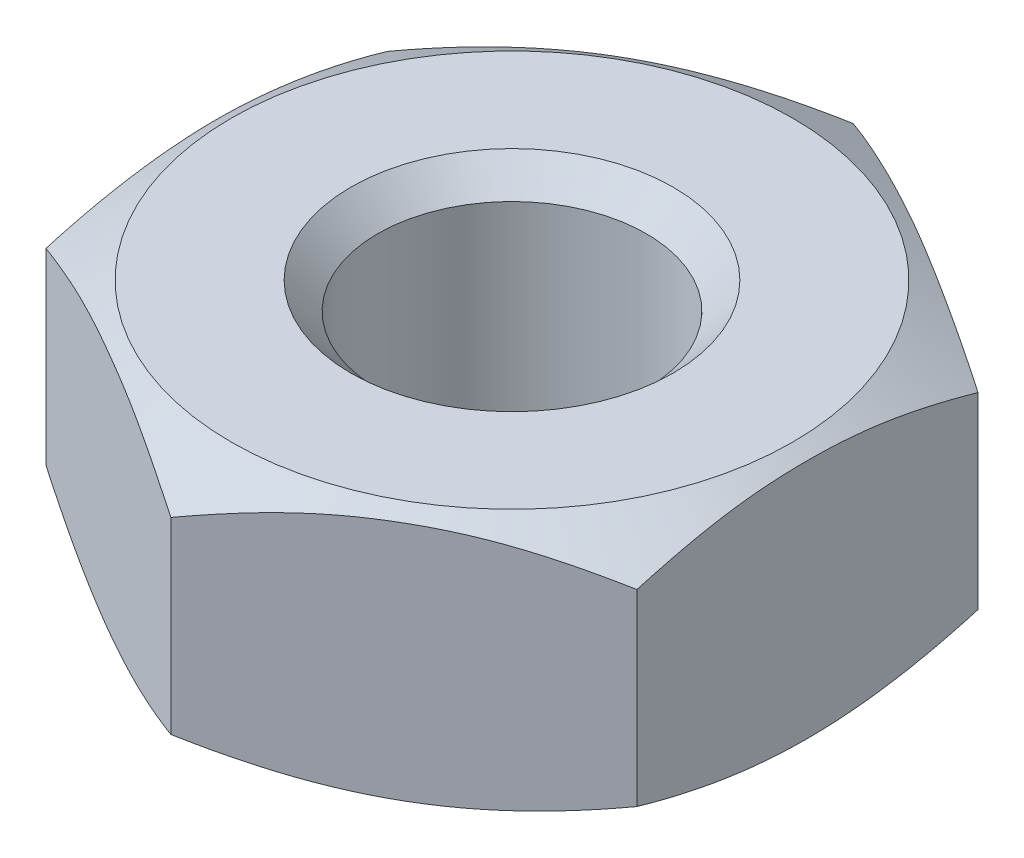
ISO-10303-21;
HEADER;
FILE_DESCRIPTION(('STEP AP214'),'2;1');
FILE_NAME('part.step','',(''),(''),'','','');
FILE_SCHEMA(('AUTOMOTIVE_DESIGN { 1 0 10303 214 1 1 1 1 }'));
ENDSEC;
DATA;
#1=APPLICATION_CONTEXT('core data for automotive mechanical design processes');
#2=APPLICATION_PROTOCOL_DEFINITION('international standard','automotive_design',2000,#1);
#3=PRODUCT_CONTEXT('',#1,'mechanical');
#4=PRODUCT('Part','Part','',(#3));
#5=PRODUCT_RELATED_PRODUCT_CATEGORY('part','',(#4));
#6=PRODUCT_DEFINITION_FORMATION('','',#4);
#7=PRODUCT_DEFINITION_CONTEXT('part definition',#1,'design');
#8=PRODUCT_DEFINITION('design','',#6,#7);
#9=PRODUCT_DEFINITION_SHAPE('','',#8);
#10=(LENGTH_UNIT() NAMED_UNIT(*) SI_UNIT(.MILLI.,.METRE.));
#11=(NAMED_UNIT(*) PLANE_ANGLE_UNIT() SI_UNIT($,.RADIAN.));
#12=(NAMED_UNIT(*) SI_UNIT($,.STERADIAN.) SOLID_ANGLE_UNIT());
#13=UNCERTAINTY_MEASURE_WITH_UNIT(LENGTH_MEASURE(1.E-05),#10,'distance_accuracy_value','');
#14=(GEOMETRIC_REPRESENTATION_CONTEXT(3) GLOBAL_UNCERTAINTY_ASSIGNED_CONTEXT((#13)) GLOBAL_UNIT_ASSIGNED_CONTEXT((#10,
#11,#12)) REPRESENTATION_CONTEXT('',''));
#15=CARTESIAN_POINT('',(0.,0.,0.));
#16=DIRECTION('',(0.,0.,1.));
#17=DIRECTION('',(1.,0.,0.));
#18=AXIS2_PLACEMENT_3D('',#15,#16,#17);
#19=CARTESIAN_POINT('',(-2.75,0.,-1.587713240271));
#20=DIRECTION('',(-1.,0.,0.));
#21=DIRECTION('',(0.,0.,1.));
#22=AXIS2_PLACEMENT_3D('',#19,#20,#21);
#23=PLANE('',#22);
#24=DIRECTION('',(0.,1.,0.));
#25=VECTOR('',#24,1.);
#26=CARTESIAN_POINT('',(-2.75000000001,0.3250057550854,-1.587713240281));
#27=LINE('',#26,#25);
#28=CARTESIAN_POINT('',(-2.75,0.3250057550754,-1.587713240271));
#29=VERTEX_POINT('',#28);
#30=CARTESIAN_POINT('',(-2.75,2.074994244925,-1.587713240271));
#31=VERTEX_POINT('',#30);
#32=EDGE_CURVE('E282',#29,#31,#27,.T.);
#33=ORIENTED_EDGE('',*,*,#32,.F.);
#34=CARTESIAN_POINT('',(-2.75,0.3250057550854,-1.587713240281));
#35=CARTESIAN_POINT('',(-2.75,0.201279179498766,-1.1591118099588));
#36=CARTESIAN_POINT('',(-2.75,0.1410366418846,-0.773480202368952));
#37=CARTESIAN_POINT('',(-2.75,0.079680933387279,-0.380722834573868));
#38=CARTESIAN_POINT('',(-2.75,0.079567033967487,-0.00101546801927507));
#39=CARTESIAN_POINT('',(-2.75,0.0794533710850477,0.377903352154305));
#40=CARTESIAN_POINT('',(-2.75,0.14081678660933,0.77195700034004));
#41=CARTESIAN_POINT('',(-2.75,0.200902921329479,1.15780841342647));
#42=CARTESIAN_POINT('',(-2.75,0.3250057550854,1.587713240281));
#43=B_SPLINE_CURVE_WITH_KNOTS('',2,(#34,#35,#36,#37,#38,#39,#40,#41,#42),.UNSPECIFIED.,.F.,.F.,
(3,2,2,2,3),(0.,0.25,0.5,0.75,1.),.UNSPECIFIED.);
#44=CARTESIAN_POINT('',(-2.75,0.3250057550754,1.587713240271));
#45=VERTEX_POINT('',#44);
#46=EDGE_CURVE('E329',#29,#45,#43,.T.);
#47=ORIENTED_EDGE('',*,*,#46,.T.);
#48=DIRECTION('',(0.,1.,0.));
#49=VECTOR('',#48,1.);
#50=CARTESIAN_POINT('',(-2.75000000001,0.3250057550854,1.587713240281));
#51=LINE('',#50,#49);
#52=CARTESIAN_POINT('',(-2.75,2.074994244925,1.587713240271));
#53=VERTEX_POINT('',#52);
#54=EDGE_CURVE('E30',#45,#53,#51,.T.);
#55=ORIENTED_EDGE('',*,*,#54,.T.);
#56=CARTESIAN_POINT('',(-2.74999999128356,2.07499422748575,-1.58771323523912));
#57=CARTESIAN_POINT('',(-2.75028148832825,2.09507326711435,-1.51765403939934));
#58=CARTESIAN_POINT('',(-2.75033237406656,2.11433844946116,-1.44735143186052));
#59=CARTESIAN_POINT('',(-2.75016787811501,2.15022786533262,-1.30882451519463));
#60=CARTESIAN_POINT('',(-2.74996219023658,2.16692302840137,-1.2406185090237));
#61=CARTESIAN_POINT('',(-2.7494801885173,2.19768112369123,-1.10589064822893));
#62=CARTESIAN_POINT('',(-2.74920632704011,2.21181084910529,-1.03938416137114));
#63=CARTESIAN_POINT('',(-2.74873977495083,2.23744125874207,-0.907613566677989));
#64=CARTESIAN_POINT('',(-2.74854520150109,2.24899954164689,-0.842360739382574));
#65=CARTESIAN_POINT('',(-2.74832627944972,2.26949868290227,-0.712606042844197));
#66=CARTESIAN_POINT('',(-2.74829902726868,2.27848159286191,-0.648110868234766));
#67=CARTESIAN_POINT('',(-2.74842907273076,2.29384752757066,-0.519336710230518));
#68=CARTESIAN_POINT('',(-2.74858488649798,2.3002508994918,-0.455060166015661));
#69=CARTESIAN_POINT('',(-2.74900813851976,2.31048153940453,-0.32615137386641));
#70=CARTESIAN_POINT('',(-2.74927583637636,2.31430276178358,-0.261518645910155));
#71=CARTESIAN_POINT('',(-2.749752682052,2.31939673345075,-0.131298643302522));
#72=CARTESIAN_POINT('',(-2.74996100955504,2.32063514430747,-0.0657100395514744));
#73=CARTESIAN_POINT('',(-2.75004026691913,2.32059274291269,0.0653820333948254));
#74=CARTESIAN_POINT('',(-2.74991163088768,2.31931517250674,0.130885503464186));
#75=CARTESIAN_POINT('',(-2.74958212628148,2.31415590081957,0.260970236794915));
#76=CARTESIAN_POINT('',(-2.74938218135719,2.31030697330503,0.325552786610539));
#77=CARTESIAN_POINT('',(-2.74907704428043,2.30003313195386,0.454392009355239));
#78=CARTESIAN_POINT('',(-2.74897167733799,2.29361300186953,0.51864906429048));
#79=CARTESIAN_POINT('',(-2.74891951786174,2.27822554808511,0.647411067741633));
#80=CARTESIAN_POINT('',(-2.74897408358454,2.26923699511454,0.711913466220587));
#81=CARTESIAN_POINT('',(-2.74921998209748,2.24873810873565,0.841705746512937));
#82=CARTESIAN_POINT('',(-2.7494137631477,2.23718522819615,0.906988857147244));
#83=CARTESIAN_POINT('',(-2.74984667367675,2.21157678267714,1.03883976727238));
#84=CARTESIAN_POINT('',(-2.75008686053937,2.19746345513721,1.10539627432707));
#85=CARTESIAN_POINT('',(-2.75046504105804,2.16674900917802,1.24024089860567));
#86=CARTESIAN_POINT('',(-2.75059940193158,2.15008117832634,1.30851370500105));
#87=CARTESIAN_POINT('',(-2.7505803113879,2.11425703758917,1.44718805778875));
#88=CARTESIAN_POINT('',(-2.75041567956702,2.09503003132231,1.51757140007469));
#89=CARTESIAN_POINT('',(-2.74999999128214,2.07499422748516,1.58771323524364));
#90=B_SPLINE_CURVE_WITH_KNOTS('',3,(#56,#57,#58,#59,#60,#61,#62,#63,#64,#65,#66,#67,#68,#69,#70,
#71,#72,#73,#74,#75,#76,#77,#78,#79,#80,#81,#82,#83,#84,#85,#86,#87,#88,#89),.UNSPECIFIED.,.F.,
.F.,(4,2,2,2,2,2,2,2,2,2,2,2,2,2,2,2,4),(0.,0.218648760864297,0.429281162177002,
0.633219332777679,0.831984197815678,1.02728985363373,1.22102328213142,1.41520874344338,
1.61195985519173,1.80845761870852,2.00249748222137,2.19617799707696,2.39150813131311,
2.59036019557369,2.79443503701656,3.00524234833371,3.22409536251514),.UNSPECIFIED.);
#91=EDGE_CURVE('E204',#31,#53,#90,.T.);
#92=ORIENTED_EDGE('',*,*,#91,.F.);
#93=EDGE_LOOP('',(#33,#47,#55,#92));
#94=FACE_BOUND('',#93,.T.);
#95=ADVANCED_FACE('F17',(#94),#23,.T.);
#96=CARTESIAN_POINT('',(2.75,0.,-1.587713240271));
#97=DIRECTION('',(0.500000000000017,0.,-0.866025403784429));
#98=DIRECTION('',(0.,-1.,0.));
#99=AXIS2_PLACEMENT_3D('',#96,#97,#98);
#100=PLANE('',#99);
#101=DIRECTION('',(0.,1.,0.));
#102=VECTOR('',#101,1.);
#103=CARTESIAN_POINT('',(2.75000000001,0.3250057550854,-1.587713240281));
#104=LINE('',#103,#102);
#105=CARTESIAN_POINT('',(2.75,0.3250057550754,-1.587713240271));
#106=VERTEX_POINT('',#105);
#107=CARTESIAN_POINT('',(2.75,2.074994244925,-1.587713240271));
#108=VERTEX_POINT('',#107);
#109=EDGE_CURVE('E143',#106,#108,#104,.T.);
#110=ORIENTED_EDGE('',*,*,#109,.F.);
#111=CARTESIAN_POINT('',(2.75000000000317,0.3250057550854,-1.58771324026917));
#112=CARTESIAN_POINT('',(2.37882029603068,0.201279187094432,-1.80201394227542));
#113=CARTESIAN_POINT('',(2.04485346758023,0.141036654216811,-1.9948297805817));
#114=CARTESIAN_POINT('',(1.70471559073008,0.0796809581312348,-2.19120847534273));
#115=CARTESIAN_POINT('',(1.37587932246273,0.0795670668543331,-2.38106218334621));
#116=CARTESIAN_POINT('',(1.0477259793583,0.0794534121061428,-2.57052160432304));
#117=CARTESIAN_POINT('',(0.706465516113512,0.140816823607388,-2.7675484246412));
#118=CARTESIAN_POINT('',(0.372308408456231,0.200902952273666,-2.96047412069877));
#119=CARTESIAN_POINT('',(-4.53196508098941E-12,0.3250057550854,-3.17542648054516));
#120=B_SPLINE_CURVE_WITH_KNOTS('',2,(#111,#112,#113,#114,#115,#116,#117,#118,#119),
.UNSPECIFIED.,.F.,.F.,(3,2,2,2,3),(0.,0.25,0.5,0.75,1.),.UNSPECIFIED.);
#121=CARTESIAN_POINT('',(0.,0.3250057550754,-3.175426480543));
#122=VERTEX_POINT('',#121);
#123=EDGE_CURVE('E128',#106,#122,#120,.T.);
#124=ORIENTED_EDGE('',*,*,#123,.T.);
#125=DIRECTION('',(0.,1.,0.));
#126=VECTOR('',#125,1.);
#127=CARTESIAN_POINT('',(0.,0.3250057550854,-3.175426480553));
#128=LINE('',#127,#126);
#129=CARTESIAN_POINT('',(0.,2.074994244925,-3.175426480543));
#130=VERTEX_POINT('',#129);
#131=EDGE_CURVE('E278',#122,#130,#128,.T.);
#132=ORIENTED_EDGE('',*,*,#131,.T.);
#133=CARTESIAN_POINT('',(2.74999999128246,2.07499422748652,-1.58771323523834));
#134=CARTESIAN_POINT('',(2.68946507508229,2.09507413711056,-1.62298814266291));
#135=CARTESIAN_POINT('',(2.628604042085,2.11434009659803,-1.65818507938357));
#136=CARTESIAN_POINT('',(2.50854872233432,2.15023083966827,-1.72730925016274));
#137=CARTESIAN_POINT('',(2.44937513360386,2.16692655898418,-1.76123572539283));
#138=CARTESIAN_POINT('',(2.33245112868928,2.19768554062108,-1.82818549374969));
#139=CARTESIAN_POINT('',(2.2747152475352,2.21181560027566,-1.86120322533643));
#140=CARTESIAN_POINT('',(2.16035990506031,2.23744645502464,-1.92668786362478));
#141=CARTESIAN_POINT('',(2.1037492712936,2.24900484957543,-1.95914749941278));
#142=CARTESIAN_POINT('',(1.99126329084751,2.26950399344229,-2.02383878722816));
#143=CARTESIAN_POINT('',(1.93539228971531,2.27848679055797,-2.05606457861549));
#144=CARTESIAN_POINT('',(1.82392952075254,2.29385228784722,-2.1205679570167));
#145=CARTESIAN_POINT('',(1.76833912295323,2.30025532591689,-2.15284304126767));
#146=CARTESIAN_POINT('',(1.65690573063352,2.3104850774732,-2.21766780195512));
#147=CARTESIAN_POINT('',(1.60106244941793,2.31430573065541,-2.25021794405274));
#148=CARTESIAN_POINT('',(1.48851942609571,2.31939840295763,-2.31574474984088));
#149=CARTESIAN_POINT('',(1.4318181203404,2.32063606515242,-2.34872136402434));
#150=CARTESIAN_POINT('',(1.31832826433659,2.32059182837136,-2.41433531138168));
#151=CARTESIAN_POINT('',(1.26153995316628,2.31931351336994,-2.44697306068883));
#152=CARTESIAN_POINT('',(1.14872565201552,2.31415294918607,-2.51172538544415));
#153=CARTESIAN_POINT('',(1.09269900780987,2.31030345539606,-2.54384140019746));
#154=CARTESIAN_POINT('',(0.98097507072716,2.30002873020264,-2.60799282796062));
#155=CARTESIAN_POINT('',(0.925277360730478,2.29360826799681,-2.64002828030042));
#156=CARTESIAN_POINT('',(0.813746350786424,2.27822037895175,-2.70436066117416));
#157=CARTESIAN_POINT('',(0.757915940192916,2.26923171366002,-2.73665749150808));
#158=CARTESIAN_POINT('',(0.645641366380799,2.24873282968953,-2.80176345170299));
#159=CARTESIAN_POINT('',(0.58920429254756,2.23718006011364,-2.83457131647058));
#160=CARTESIAN_POINT('',(0.475240137136877,2.21157205714959,-2.90086871616841));
#161=CARTESIAN_POINT('',(0.417723363848265,2.19745906196917,-2.93435352031078));
#162=CARTESIAN_POINT('',(0.301139037682912,2.1667454974526,-3.00210043505811));
#163=CARTESIAN_POINT('',(0.242082926724602,2.15007821978347,-3.03635174338758));
#164=CARTESIAN_POINT('',(0.121983233745394,2.11425539899494,-3.10566944326282));
#165=CARTESIAN_POINT('',(0.0609498245001459,2.09502916562337,-3.14071704926184));
#166=CARTESIAN_POINT('',(-1.35975896060945E-12,2.07499422748653,-3.17542647047675));
#167=B_SPLINE_CURVE_WITH_KNOTS('',3,(#133,#134,#135,#136,#137,#138,#139,#140,#141,#142,#143,
#144,#145,#146,#147,#148,#149,#150,#151,#152,#153,#154,#155,#156,#157,#158,#159,#160,#161,#162,
#163,#164,#165,#166),.UNSPECIFIED.,.F.,.F.,(4,2,2,2,2,2,2,2,2,2,2,2,2,2,2,2,4),(0.,
0.218658229031319,0.429299945728665,0.633247468775946,0.83202194777125,1.02733773360048,
1.22108208454189,1.41527954781984,1.61204402697204,1.8085284207218,2.00255627663355,
2.19622586213315,2.39154586032507,2.59038830766808,2.79445379885586,3.00525180396911,
3.22409536767955),.UNSPECIFIED.);
#168=EDGE_CURVE('E255',#108,#130,#167,.T.);
#169=ORIENTED_EDGE('',*,*,#168,.F.);
#170=EDGE_LOOP('',(#110,#124,#132,#169));
#171=FACE_BOUND('',#170,.T.);
#172=ADVANCED_FACE('F19',(#171),#100,.T.);
#173=CARTESIAN_POINT('',(0.,0.,3.175426480543));
#174=DIRECTION('',(0.500000000000017,0.,0.866025403784429));
#175=DIRECTION('',(0.,-1.,0.));
#176=AXIS2_PLACEMENT_3D('',#173,#174,#175);
#177=PLANE('',#176);
#178=DIRECTION('',(0.,1.,0.));
#179=VECTOR('',#178,1.);
#180=CARTESIAN_POINT('',(0.,0.3250057550854,3.175426480553));
#181=LINE('',#180,#179);
#182=CARTESIAN_POINT('',(0.,0.3250057550754,3.175426480543));
#183=VERTEX_POINT('',#182);
#184=CARTESIAN_POINT('',(0.,2.074994244925,3.175426480543));
#185=VERTEX_POINT('',#184);
#186=EDGE_CURVE('E11',#183,#185,#181,.T.);
#187=ORIENTED_EDGE('',*,*,#186,.F.);
#188=CARTESIAN_POINT('',(-4.33015720195764E-12,0.3250057550854,3.1754264805455));
#189=CARTESIAN_POINT('',(0.371179704012347,0.201279187088551,2.96112577851374));
#190=CARTESIAN_POINT('',(0.705146532490621,0.14103665421062,2.76830994019139));
#191=CARTESIAN_POINT('',(1.0452844093586,0.0796809581266252,2.57193124542007));
#192=CARTESIAN_POINT('',(1.37412067762929,0.079567066853248,2.38207753741466));
#193=CARTESIAN_POINT('',(1.70227402072653,0.0794534121085786,2.19261811644198));
#194=CARTESIAN_POINT('',(2.04353448395308,0.140816823611951,1.99559129613435));
#195=CARTESIAN_POINT('',(2.37769159157981,0.200902952278033,1.80266560009442));
#196=CARTESIAN_POINT('',(2.75000000000337,0.3250057550854,1.58771324026951));
#197=B_SPLINE_CURVE_WITH_KNOTS('',2,(#188,#189,#190,#191,#192,#193,#194,#195,#196),
.UNSPECIFIED.,.F.,.F.,(3,2,2,2,3),(0.,0.25,0.5,0.75,1.),.UNSPECIFIED.);
#198=CARTESIAN_POINT('',(2.75,0.3250057550754,1.587713240271));
#199=VERTEX_POINT('',#198);
#200=EDGE_CURVE('E115',#183,#199,#197,.T.);
#201=ORIENTED_EDGE('',*,*,#200,.T.);
#202=DIRECTION('',(0.,1.,0.));
#203=VECTOR('',#202,1.);
#204=CARTESIAN_POINT('',(2.75000000001,0.3250057550854,1.587713240281));
#205=LINE('',#204,#203);
#206=CARTESIAN_POINT('',(2.75,2.074994244925,1.587713240271));
#207=VERTEX_POINT('',#206);
#208=EDGE_CURVE('E121',#199,#207,#205,.T.);
#209=ORIENTED_EDGE('',*,*,#208,.T.);
#210=CARTESIAN_POINT('',(-1.15211104051648E-12,2.07499422748638,3.17542647047701));
#211=CARTESIAN_POINT('',(0.0608164240454571,2.0950741371104,3.14063914894404));
#212=CARTESIAN_POINT('',(0.12172838188024,2.11434009659787,3.10553041662813));
#213=CARTESIAN_POINT('',(0.241619329666963,2.15023083966811,3.03612154525407));
#214=CARTESIAN_POINT('',(0.300587313442756,2.16692655898401,3.00183895179538));
#215=CARTESIAN_POINT('',(0.417029516075231,2.19768554062092,2.9340546774054));
#216=CARTESIAN_POINT('',(0.474491650981954,2.2118156002755,2.90056280340936));
#217=CARTESIAN_POINT('',(0.588380682535034,2.23744645502448,2.83427049091164));
#218=CARTESIAN_POINT('',(0.64479686860844,2.24900484957526,2.80147406183925));
#219=CARTESIAN_POINT('',(0.757064157483081,2.26950399344212,2.7364039891109));
#220=CARTESIAN_POINT('',(0.812908012047544,2.2784867905578,2.70413117848918));
#221=CARTESIAN_POINT('',(0.924500960853926,2.29385228784706,2.63985327819186));
#222=CARTESIAN_POINT('',(0.980247202623946,2.30025532591673,2.60784812361669));
#223=CARTESIAN_POINT('',(1.09210378833273,2.31048507747304,2.54375635538182));
#224=CARTESIAN_POINT('',(1.14821467889347,2.31430573065526,2.51166972626739));
#225=CARTESIAN_POINT('',(1.26123406899506,2.31939840295747,2.44696801194611));
#226=CARTESIAN_POINT('',(1.3181433074859,2.32063606515226,2.41435154782628));
#227=CARTESIAN_POINT('',(1.43171158074173,2.32059182837122,2.34887342313388));
#228=CARTESIAN_POINT('',(1.4883708563496,2.31931351336979,2.31601217767573));
#229=CARTESIAN_POINT('',(1.60085516511782,2.31415294918591,2.25068828934621));
#230=CARTESIAN_POINT('',(1.65668177186557,2.31030345539591,2.21822579955178));
#231=CARTESIAN_POINT('',(1.76810050653922,2.30002873020249,2.15354574570855));
#232=CARTESIAN_POINT('',(1.82369287708568,2.29360826799666,2.12132784008855));
#233=CARTESIAN_POINT('',(1.93517185818045,2.2782203789516,2.0569053426039));
#234=CARTESIAN_POINT('',(1.99105693900811,2.26923171365988,2.02470320389308));
#235=CARTESIAN_POINT('',(2.10357764138068,2.24873282968938,1.9600235508701));
#236=CARTESIAN_POINT('',(2.16020862262988,2.23718006011349,1.92755154359907));
#237=CARTESIAN_POINT('',(2.27460593267817,2.21157205714945,1.86200438974164));
#238=CARTESIAN_POINT('',(2.33236301035036,2.19745906196902,1.82893580500132));
#239=CARTESIAN_POINT('',(2.44932572263187,2.16674549745246,1.76184427423311));
#240=CARTESIAN_POINT('',(2.50851628123698,2.15007821978333,1.72782583605952));
#241=CARTESIAN_POINT('',(2.62859701674996,2.1142553989948,1.65847530089116));
#242=CARTESIAN_POINT('',(2.6894658385093,2.09502916562323,1.62314262100517));
#243=CARTESIAN_POINT('',(2.74999999128258,2.07499422748638,1.58771323523864));
#244=B_SPLINE_CURVE_WITH_KNOTS('',3,(#210,#211,#212,#213,#214,#215,#216,#217,#218,#219,#220,
#221,#222,#223,#224,#225,#226,#227,#228,#229,#230,#231,#232,#233,#234,#235,#236,#237,#238,#239,
#240,#241,#242,#243),.UNSPECIFIED.,.F.,.F.,(4,2,2,2,2,2,2,2,2,2,2,2,2,2,2,2,4),(0.,
0.218658229032988,0.429299945731537,0.633247468779547,0.832021947775108,1.02733773360411,
1.2210820845448,1.41527954782154,1.61204402697203,1.80852842072312,2.00255627663581,
2.19622586213596,2.39154586032805,2.59038830767085,2.79445379885804,3.00525180397033,
3.22409536767943),.UNSPECIFIED.);
#245=EDGE_CURVE('E253',#185,#207,#244,.T.);
#246=ORIENTED_EDGE('',*,*,#245,.F.);
#247=EDGE_LOOP('',(#187,#201,#209,#246));
#248=FACE_BOUND('',#247,.T.);
#249=ADVANCED_FACE('F118',(#248),#177,.T.);
#250=CARTESIAN_POINT('',(-2.75,0.,1.587713240271));
#251=DIRECTION('',(-0.500000000000017,0.,0.866025403784429));
#252=DIRECTION('',(0.,1.,0.));
#253=AXIS2_PLACEMENT_3D('',#250,#251,#252);
#254=PLANE('',#253);
#255=ORIENTED_EDGE('',*,*,#54,.F.);
#256=CARTESIAN_POINT('',(-2.75000000000317,0.3250057550854,1.58771324026917));
#257=CARTESIAN_POINT('',(-2.37882029603068,0.201279187094432,1.80201394227542));
#258=CARTESIAN_POINT('',(-2.04485346758023,0.141036654216811,1.9948297805817));
#259=CARTESIAN_POINT('',(-1.70471559073008,0.0796809581312348,2.19120847534273));
#260=CARTESIAN_POINT('',(-1.37587932246273,0.0795670668543331,2.38106218334621));
#261=CARTESIAN_POINT('',(-1.0477259793583,0.0794534121061428,2.57052160432304));
#262=CARTESIAN_POINT('',(-0.706465516113512,0.140816823607388,2.7675484246412));
#263=CARTESIAN_POINT('',(-0.372308408456231,0.200902952273666,2.96047412069877));
#264=CARTESIAN_POINT('',(4.53196508098941E-12,0.3250057550854,3.17542648054516));
#265=B_SPLINE_CURVE_WITH_KNOTS('',2,(#256,#257,#258,#259,#260,#261,#262,#263,#264),
.UNSPECIFIED.,.F.,.F.,(3,2,2,2,3),(0.,0.25,0.5,0.75,1.),.UNSPECIFIED.);
#266=EDGE_CURVE('E127',#45,#183,#265,.T.);
#267=ORIENTED_EDGE('',*,*,#266,.T.);
#268=ORIENTED_EDGE('',*,*,#186,.T.);
#269=CARTESIAN_POINT('',(-2.74999999128247,2.07499422748652,1.58771323523833));
#270=CARTESIAN_POINT('',(-2.6894650750823,2.09507413711056,1.62298814266289));
#271=CARTESIAN_POINT('',(-2.62860404208501,2.11434009659803,1.65818507938355));
#272=CARTESIAN_POINT('',(-2.50854872233433,2.15023083966827,1.72730925016272));
#273=CARTESIAN_POINT('',(-2.44937513360387,2.16692655898418,1.76123572539282));
#274=CARTESIAN_POINT('',(-2.3324511286893,2.19768554062108,1.82818549374967));
#275=CARTESIAN_POINT('',(-2.27471524753521,2.21181560027566,1.86120322533641));
#276=CARTESIAN_POINT('',(-2.16035990506032,2.23744645502464,1.92668786362476));
#277=CARTESIAN_POINT('',(-2.10374927129362,2.24900484957543,1.95914749941276));
#278=CARTESIAN_POINT('',(-1.99126329084752,2.26950399344229,2.02383878722815));
#279=CARTESIAN_POINT('',(-1.93539228971533,2.27848679055797,2.05606457861547));
#280=CARTESIAN_POINT('',(-1.82392952075255,2.29385228784722,2.12056795701669));
#281=CARTESIAN_POINT('',(-1.76833912295323,2.30025532591689,2.15284304126766));
#282=CARTESIAN_POINT('',(-1.65690573063352,2.3104850774732,2.21766780195511));
#283=CARTESIAN_POINT('',(-1.60106244941793,2.31430573065541,2.25021794405274));
#284=CARTESIAN_POINT('',(-1.4885194260957,2.31939840295763,2.31574474984088));
#285=CARTESIAN_POINT('',(-1.4318181203404,2.32063606515242,2.34872136402434));
#286=CARTESIAN_POINT('',(-1.31832826433658,2.32059182837136,2.4143353113817));
#287=CARTESIAN_POINT('',(-1.26153995316625,2.31931351336994,2.44697306068885));
#288=CARTESIAN_POINT('',(-1.14872565201546,2.31415294918607,2.51172538544417));
#289=CARTESIAN_POINT('',(-1.09269900780981,2.31030345539606,2.54384140019749));
#290=CARTESIAN_POINT('',(-0.98097507072708,2.30002873020264,2.60799282796065));
#291=CARTESIAN_POINT('',(-0.925277360730392,2.29360826799681,2.64002828030045));
#292=CARTESIAN_POINT('',(-0.813746350786328,2.27822037895175,2.70436066117419));
#293=CARTESIAN_POINT('',(-0.757915940192816,2.26923171366002,2.73665749150811));
#294=CARTESIAN_POINT('',(-0.645641366380697,2.24873282968953,2.80176345170302));
#295=CARTESIAN_POINT('',(-0.589204292547459,2.23718006011364,2.8345713164706));
#296=CARTESIAN_POINT('',(-0.475240137136781,2.21157205714959,2.90086871616842));
#297=CARTESIAN_POINT('',(-0.417723363848173,2.19745906196917,2.9343535203108));
#298=CARTESIAN_POINT('',(-0.301139037682834,2.1667454974526,3.00210043505812));
#299=CARTESIAN_POINT('',(-0.242082926724534,2.15007821978347,3.03635174338758));
#300=CARTESIAN_POINT('',(-0.121983233745351,2.11425539899494,3.10566944326282));
#301=CARTESIAN_POINT('',(-0.0609498245001176,2.09502916562337,3.14071704926184));
#302=CARTESIAN_POINT('',(1.3720979711413E-12,2.07499422748653,3.17542647047675));
#303=B_SPLINE_CURVE_WITH_KNOTS('',3,(#269,#270,#271,#272,#273,#274,#275,#276,#277,#278,#279,
#280,#281,#282,#283,#284,#285,#286,#287,#288,#289,#290,#291,#292,#293,#294,#295,#296,#297,#298,
#299,#300,#301,#302),.UNSPECIFIED.,.F.,.F.,(4,2,2,2,2,2,2,2,2,2,2,2,2,2,2,2,4),(0.,
0.218658229031318,0.429299945728663,0.633247468775944,0.832021947771249,1.02733773360049,
1.2210820845419,1.41527954781986,1.61204402697207,1.80852842072187,2.00255627663365,
2.19622586213327,2.39154586032519,2.5903883076682,2.79445379885596,3.00525180396919,
3.22409536767958),.UNSPECIFIED.);
#304=EDGE_CURVE('E275',#53,#185,#303,.T.);
#305=ORIENTED_EDGE('',*,*,#304,.F.);
#306=EDGE_LOOP('',(#255,#267,#268,#305));
#307=FACE_BOUND('',#306,.T.);
#308=ADVANCED_FACE('F168',(#307),#254,.T.);
#309=CARTESIAN_POINT('',(0.,2.275,0.));
#310=DIRECTION('',(0.,1.,0.));
#311=DIRECTION('',(1.,0.,0.));
#312=AXIS2_PLACEMENT_3D('',#309,#310,#311);
#313=CONICAL_SURFACE('',#312,1.375,0.7853981634);
#314=CARTESIAN_POINT('',(0.,2.15000000001,0.));
#315=DIRECTION('',(0.,1.,0.));
#316=DIRECTION('',(1.,0.,0.));
#317=AXIS2_PLACEMENT_3D('',#314,#315,#316);
#318=CIRCLE('',#317,1.25);
#319=CARTESIAN_POINT('',(1.25,2.15000000001,0.));
#320=VERTEX_POINT('',#319);
#321=EDGE_CURVE('E41',#320,#320,#318,.T.);
#322=ORIENTED_EDGE('',*,*,#321,.F.);
#323=EDGE_LOOP('',(#322));
#324=FACE_BOUND('',#323,.T.);
#325=CARTESIAN_POINT('',(0.,2.40000000001,0.));
#326=DIRECTION('',(0.,1.,0.));
#327=DIRECTION('',(-1.,0.,0.));
#328=AXIS2_PLACEMENT_3D('',#325,#326,#327);
#329=CIRCLE('',#328,1.5);
#330=CARTESIAN_POINT('',(-1.5,2.40000000001,0.));
#331=VERTEX_POINT('',#330);
#332=EDGE_CURVE('E274',#331,#331,#329,.T.);
#333=ORIENTED_EDGE('',*,*,#332,.T.);
#334=EDGE_LOOP('',(#333));
#335=FACE_BOUND('',#334,.T.);
#336=ADVANCED_FACE('F176',(#324,#335),#313,.F.);
#337=CARTESIAN_POINT('',(0.,2.4,0.));
#338=DIRECTION('',(0.,-1.,0.));
#339=DIRECTION('',(1.,0.,0.));
#340=AXIS2_PLACEMENT_3D('',#337,#338,#339);
#341=CYLINDRICAL_SURFACE('',#340,1.25);
#342=CARTESIAN_POINT('',(0.,0.25000000001,0.));
#343=DIRECTION('',(0.,1.,0.));
#344=DIRECTION('',(-1.,0.,0.));
#345=AXIS2_PLACEMENT_3D('',#342,#343,#344);
#346=CIRCLE('',#345,1.25);
#347=CARTESIAN_POINT('',(-1.25,0.25000000001,0.));
#348=VERTEX_POINT('',#347);
#349=EDGE_CURVE('E48',#348,#348,#346,.T.);
#350=ORIENTED_EDGE('',*,*,#349,.F.);
#351=EDGE_LOOP('',(#350));
#352=FACE_BOUND('',#351,.T.);
#353=ORIENTED_EDGE('',*,*,#321,.T.);
#354=EDGE_LOOP('',(#353));
#355=FACE_BOUND('',#354,.T.);
#356=ADVANCED_FACE('F356',(#352,#355),#341,.F.);
#357=CARTESIAN_POINT('',(0.,0.125,0.));
#358=DIRECTION('',(0.,-1.,0.));
#359=DIRECTION('',(-1.,0.,0.));
#360=AXIS2_PLACEMENT_3D('',#357,#358,#359);
#361=CONICAL_SURFACE('',#360,1.375,0.7853981634);
#362=ORIENTED_EDGE('',*,*,#349,.T.);
#363=EDGE_LOOP('',(#362));
#364=FACE_BOUND('',#363,.T.);
#365=CARTESIAN_POINT('',(0.,0.,0.));
#366=DIRECTION('',(0.,1.,0.));
#367=DIRECTION('',(-1.,0.,0.));
#368=AXIS2_PLACEMENT_3D('',#365,#366,#367);
#369=CIRCLE('',#368,1.5);
#370=CARTESIAN_POINT('',(-1.5,0.,0.));
#371=VERTEX_POINT('',#370);
#372=EDGE_CURVE('E279',#371,#371,#369,.T.);
#373=ORIENTED_EDGE('',*,*,#372,.F.);
#374=EDGE_LOOP('',(#373));
#375=FACE_BOUND('',#374,.T.);
#376=ADVANCED_FACE('F366',(#364,#375),#361,.F.);
#377=CARTESIAN_POINT('',(0.,0.,0.));
#378=DIRECTION('',(0.,1.,0.));
#379=DIRECTION('',(1.,0.,0.));
#380=AXIS2_PLACEMENT_3D('',#377,#378,#379);
#381=PLANE('',#380);
#382=ORIENTED_EDGE('',*,*,#372,.T.);
#383=EDGE_LOOP('',(#382));
#384=FACE_BOUND('',#383,.T.);
#385=CARTESIAN_POINT('',(0.,0.,0.));
#386=DIRECTION('',(0.,1.,0.));
#387=DIRECTION('',(-0.866025403783729,0.,-0.50000000000123));
#388=AXIS2_PLACEMENT_3D('',#385,#386,#387);
#389=CIRCLE('',#388,2.6125);
#390=CARTESIAN_POINT('',(-2.26249136738499,0.,-1.30625000000321));
#391=VERTEX_POINT('',#390);
#392=EDGE_CURVE('E256',#391,#391,#389,.T.);
#393=ORIENTED_EDGE('',*,*,#392,.F.);
#394=EDGE_LOOP('',(#393));
#395=FACE_BOUND('',#394,.T.);
#396=ADVANCED_FACE('F313',(#384,#395),#381,.F.);
#397=CARTESIAN_POINT('',(0.,0.,-3.175426480543));
#398=DIRECTION('',(-0.500000000000017,0.,-0.866025403784429));
#399=DIRECTION('',(-0.866025403784429,0.,0.500000000000017));
#400=AXIS2_PLACEMENT_3D('',#397,#398,#399);
#401=PLANE('',#400);
#402=ORIENTED_EDGE('',*,*,#131,.F.);
#403=CARTESIAN_POINT('',(4.33015720195764E-12,0.3250057550854,-3.1754264805455));
#404=CARTESIAN_POINT('',(-0.371179704012272,0.201279187088578,-2.96112577851378));
#405=CARTESIAN_POINT('',(-0.705146532490594,0.141036654210603,-2.76830994019141));
#406=CARTESIAN_POINT('',(-1.0452844093585,0.0796809581265867,-2.57193124542013));
#407=CARTESIAN_POINT('',(-1.37412067762919,0.0795670668532095,-2.38207753741472));
#408=CARTESIAN_POINT('',(-1.70227402072643,0.0794534121085402,-2.19261811644204));
#409=CARTESIAN_POINT('',(-2.04353448395296,0.140816823611911,-1.99559129613442));
#410=CARTESIAN_POINT('',(-2.37769159157967,0.200902952277988,-1.8026656000945));
#411=CARTESIAN_POINT('',(-2.75000000000337,0.3250057550854,-1.58771324026951));
#412=B_SPLINE_CURVE_WITH_KNOTS('',2,(#403,#404,#405,#406,#407,#408,#409,#410,#411),
.UNSPECIFIED.,.F.,.F.,(3,2,2,2,3),(0.,0.25,0.5,0.75,1.),.UNSPECIFIED.);
#413=EDGE_CURVE('E394',#122,#29,#412,.T.);
#414=ORIENTED_EDGE('',*,*,#413,.T.);
#415=ORIENTED_EDGE('',*,*,#32,.T.);
#416=CARTESIAN_POINT('',(1.16797548262885E-12,2.07499422748638,-3.17542647047702));
#417=CARTESIAN_POINT('',(-0.0608164240451862,2.09507413711031,-3.1406391489442));
#418=CARTESIAN_POINT('',(-0.12172838187973,2.11434009659769,-3.10553041662847));
#419=CARTESIAN_POINT('',(-0.241619329666093,2.15023083966776,-3.03612154525474));
#420=CARTESIAN_POINT('',(-0.300587313441763,2.1669265589836,-3.00183895179619));
#421=CARTESIAN_POINT('',(-0.417029516074095,2.1976855406204,-2.93405467740646));
#422=CARTESIAN_POINT('',(-0.474491650980798,2.21181560027494,-2.90056280341052));
#423=CARTESIAN_POINT('',(-0.588380682533917,2.23744645502387,-2.83427049091295));
#424=CARTESIAN_POINT('',(-0.644796868607383,2.24900484957464,-2.80147406184061));
#425=CARTESIAN_POINT('',(-0.75706415748221,2.2695039934415,-2.73640398911227));
#426=CARTESIAN_POINT('',(-0.8129080120468,2.27848679055719,-2.70413117849051));
#427=CARTESIAN_POINT('',(-0.924500960853483,2.2938522878465,-2.63985327819305));
#428=CARTESIAN_POINT('',(-0.980247202623678,2.30025532591621,-2.60784812361776));
#429=CARTESIAN_POINT('',(-1.09210378833284,2.31048507747262,-2.54375635538257));
#430=CARTESIAN_POINT('',(-1.14821467889379,2.3143057306549,-2.51166972626793));
#431=CARTESIAN_POINT('',(-1.2612340689958,2.31939840295728,-2.44696801194611));
#432=CARTESIAN_POINT('',(-1.31814330748684,2.32063606515217,-2.41435154782594));
#433=CARTESIAN_POINT('',(-1.43171158074243,2.32059182837131,-2.34887342313326));
#434=CARTESIAN_POINT('',(-1.48837085634986,2.31931351336998,-2.31601217767516));
#435=CARTESIAN_POINT('',(-1.60085516511732,2.31415294918625,-2.25068828934582));
#436=CARTESIAN_POINT('',(-1.65668177186477,2.3103034553963,-2.21822579955151));
#437=CARTESIAN_POINT('',(-1.76810050653793,2.30002873020296,-2.15354574570854));
#438=CARTESIAN_POINT('',(-1.82369287708421,2.29360826799715,-2.12132784008868));
#439=CARTESIAN_POINT('',(-1.93517185817873,2.27822037895212,-2.0569053426043));
#440=CARTESIAN_POINT('',(-1.99105693900633,2.26923171366037,-2.02470320389362));
#441=CARTESIAN_POINT('',(-2.10357764137891,2.24873282968983,-1.96002355087087));
#442=CARTESIAN_POINT('',(-2.16020862262817,2.2371800601139,-1.92755154359994));
#443=CARTESIAN_POINT('',(-2.2746059326767,2.21157205714974,-1.86200438974266));
#444=CARTESIAN_POINT('',(-2.33236301034908,2.19745906196923,-1.82893580500237));
#445=CARTESIAN_POINT('',(-2.44932572263106,2.16674549745248,-1.76184427423416));
#446=CARTESIAN_POINT('',(-2.50851628123646,2.15007821978325,-1.72782583606052));
#447=CARTESIAN_POINT('',(-2.62859701675013,2.11425539899448,-1.65847530089197));
#448=CARTESIAN_POINT('',(-2.68946583850986,2.09502916562276,-1.62314262100581));
#449=CARTESIAN_POINT('',(-2.74999999128353,2.07499422748577,-1.58771323523909));
#450=B_SPLINE_CURVE_WITH_KNOTS('',3,(#416,#417,#418,#419,#420,#421,#422,#423,#424,#425,#426,
#427,#428,#429,#430,#431,#432,#433,#434,#435,#436,#437,#438,#439,#440,#441,#442,#443,#444,#445,
#446,#447,#448,#449),.UNSPECIFIED.,.F.,.F.,(4,2,2,2,2,2,2,2,2,2,2,2,2,2,2,2,4),(0.,
0.21865822903206,0.429299945730037,0.633247468777816,0.83202194777346,1.02733773360284,
1.22108208454417,1.41527954782177,1.61204402697331,1.80852842072315,2.00255627663485,
2.19622586213431,2.39154586032605,2.59038830766888,2.79445379885652,3.00525180396969,
3.22409536768014),.UNSPECIFIED.);
#451=EDGE_CURVE('E262',#130,#31,#450,.T.);
#452=ORIENTED_EDGE('',*,*,#451,.F.);
#453=EDGE_LOOP('',(#402,#414,#415,#452));
#454=FACE_BOUND('',#453,.T.);
#455=ADVANCED_FACE('F311',(#454),#401,.T.);
#456=CARTESIAN_POINT('',(0.,2.4,0.));
#457=DIRECTION('',(0.,1.,0.));
#458=DIRECTION('',(1.,0.,0.));
#459=AXIS2_PLACEMENT_3D('',#456,#457,#458);
#460=PLANE('',#459);
#461=ORIENTED_EDGE('',*,*,#332,.F.);
#462=EDGE_LOOP('',(#461));
#463=FACE_BOUND('',#462,.T.);
#464=CARTESIAN_POINT('',(0.,2.40000000001,0.));
#465=DIRECTION('',(0.,1.,0.));
#466=DIRECTION('',(-0.866025403783729,0.,-0.50000000000123));
#467=AXIS2_PLACEMENT_3D('',#464,#465,#466);
#468=CIRCLE('',#467,2.6125);
#469=CARTESIAN_POINT('',(-2.26249136738499,2.40000000001,-1.30625000000321));
#470=VERTEX_POINT('',#469);
#471=EDGE_CURVE('E271',#470,#470,#468,.T.);
#472=ORIENTED_EDGE('',*,*,#471,.T.);
#473=EDGE_LOOP('',(#472));
#474=FACE_BOUND('',#473,.T.);
#475=ADVANCED_FACE('F219',(#463,#474),#460,.T.);
#476=CARTESIAN_POINT('',(0.,2.237497122462,0.));
#477=DIRECTION('',(0.,-1.,0.));
#478=DIRECTION('',(-0.866025403784429,0.,-0.500000000000017));
#479=AXIS2_PLACEMENT_3D('',#476,#477,#478);
#480=CONICAL_SURFACE('',#479,2.8939632,1.0471975512);
#481=ORIENTED_EDGE('',*,*,#471,.F.);
#482=EDGE_LOOP('',(#481));
#483=FACE_BOUND('',#482,.T.);
#484=ORIENTED_EDGE('',*,*,#245,.T.);
#485=CARTESIAN_POINT('',(2.74999999128213,2.07499422748515,1.58771323524366));
#486=CARTESIAN_POINT('',(2.75028148832689,2.09507326711381,1.51765403940376));
#487=CARTESIAN_POINT('',(2.75033237406526,2.11433844946067,1.44735143186482));
#488=CARTESIAN_POINT('',(2.75016787811385,2.15022786533221,1.3088245151987));
#489=CARTESIAN_POINT('',(2.74996219023549,2.16692302840102,1.24061850902764));
#490=CARTESIAN_POINT('',(2.74948018851634,2.19768112369095,1.10589064823263));
#491=CARTESIAN_POINT('',(2.74920632703922,2.21181084910504,1.03938416137473));
#492=CARTESIAN_POINT('',(2.74873977495007,2.23744125874189,0.907613566681325));
#493=CARTESIAN_POINT('',(2.74854520150039,2.24899954164674,0.842360739385786));
#494=CARTESIAN_POINT('',(2.74832627944915,2.26949868290217,0.71260604284715));
#495=CARTESIAN_POINT('',(2.74829902726817,2.27848159286182,0.648110868237587));
#496=CARTESIAN_POINT('',(2.74842907273036,2.29384752757062,0.519336710233067));
#497=CARTESIAN_POINT('',(2.74858488649764,2.30025089949177,0.455060166018071));
#498=CARTESIAN_POINT('',(2.74900813851953,2.31048153940452,0.326151373868534));
#499=CARTESIAN_POINT('',(2.74927583637619,2.31430276178358,0.261518645912131));
#500=CARTESIAN_POINT('',(2.74975268205192,2.31939673345076,0.131298643304188));
#501=CARTESIAN_POINT('',(2.74996100955501,2.32063514430748,0.0657100395529788));
#502=CARTESIAN_POINT('',(2.75004026691917,2.32059274291269,-0.0653820333935951));
#503=CARTESIAN_POINT('',(2.74991163088774,2.31931517250674,-0.130885503463068));
#504=CARTESIAN_POINT('',(2.74958212628158,2.31415590081956,-0.260970236794007));
#505=CARTESIAN_POINT('',(2.74938218135731,2.31030697330502,-0.325552786609729));
#506=CARTESIAN_POINT('',(2.74907704428056,2.30003313195384,-0.45439200935461));
#507=CARTESIAN_POINT('',(2.74897167733812,2.29361300186951,-0.518649064289934));
#508=CARTESIAN_POINT('',(2.74891951786186,2.27822554808509,-0.647411067741235));
#509=CARTESIAN_POINT('',(2.74897408358466,2.26923699511452,-0.711913466220254));
#510=CARTESIAN_POINT('',(2.74921998209758,2.24873810873564,-0.841705746512719));
#511=CARTESIAN_POINT('',(2.74941376314779,2.23718522819613,-0.906988857147076));
#512=CARTESIAN_POINT('',(2.74984667367682,2.21157678267712,-1.0388397672723));
#513=CARTESIAN_POINT('',(2.75008686053942,2.19746345513719,-1.10539627432702));
#514=CARTESIAN_POINT('',(2.75046504105807,2.16674900917801,-1.24024089860567));
#515=CARTESIAN_POINT('',(2.7505994019316,2.15008117832633,-1.30851370500107));
#516=CARTESIAN_POINT('',(2.75058031138789,2.11425703758916,-1.44718805778878));
#517=CARTESIAN_POINT('',(2.75041567956701,2.09503003132231,-1.51757140007472));
#518=CARTESIAN_POINT('',(2.74999999128213,2.07499422748515,-1.58771323524367));
#519=B_SPLINE_CURVE_WITH_KNOTS('',3,(#485,#486,#487,#488,#489,#490,#491,#492,#493,#494,#495,
#496,#497,#498,#499,#500,#501,#502,#503,#504,#505,#506,#507,#508,#509,#510,#511,#512,#513,#514,
#515,#516,#517,#518),.UNSPECIFIED.,.F.,.F.,(4,2,2,2,2,2,2,2,2,2,2,2,2,2,2,2,4),(0.,
0.218648760864676,0.429281162177762,0.633219332778816,0.831984197817199,1.02728985363565,
1.22102328213376,1.41520874344617,1.611959855195,1.80845761871213,2.00249748222527,
2.19617799708111,2.39150813131746,2.59036019557818,2.79443503702115,3.00524234833835,
3.22409536251977),.UNSPECIFIED.);
#520=EDGE_CURVE('E148',#207,#108,#519,.T.);
#521=ORIENTED_EDGE('',*,*,#520,.T.);
#522=ORIENTED_EDGE('',*,*,#168,.T.);
#523=ORIENTED_EDGE('',*,*,#451,.T.);
#524=ORIENTED_EDGE('',*,*,#91,.T.);
#525=ORIENTED_EDGE('',*,*,#304,.T.);
#526=EDGE_LOOP('',(#484,#521,#522,#523,#524,#525));
#527=FACE_BOUND('',#526,.T.);
#528=ADVANCED_FACE('F210',(#483,#527),#480,.T.);
#529=CARTESIAN_POINT('',(0.,0.1625028775377,0.));
#530=DIRECTION('',(0.,1.,0.));
#531=DIRECTION('',(0.866025403784429,0.,0.500000000000017));
#532=AXIS2_PLACEMENT_3D('',#529,#530,#531);
#533=CONICAL_SURFACE('',#532,2.8939632,1.0471975512);
#534=ORIENTED_EDGE('',*,*,#392,.T.);
#535=EDGE_LOOP('',(#534));
#536=FACE_BOUND('',#535,.T.);
#537=ORIENTED_EDGE('',*,*,#46,.F.);
#538=ORIENTED_EDGE('',*,*,#413,.F.);
#539=ORIENTED_EDGE('',*,*,#123,.F.);
#540=CARTESIAN_POINT('',(2.75,0.3250057550854,1.587713240281));
#541=CARTESIAN_POINT('',(2.75,0.201279179498766,1.1591118099588));
#542=CARTESIAN_POINT('',(2.75,0.1410366418846,0.773480202368952));
#543=CARTESIAN_POINT('',(2.75,0.079680933387279,0.380722834573868));
#544=CARTESIAN_POINT('',(2.75,0.079567033967487,0.00101546801927507));
#545=CARTESIAN_POINT('',(2.75,0.0794533710850477,-0.377903352154305));
#546=CARTESIAN_POINT('',(2.75,0.14081678660933,-0.77195700034004));
#547=CARTESIAN_POINT('',(2.75,0.200902921329479,-1.15780841342647));
#548=CARTESIAN_POINT('',(2.75,0.3250057550854,-1.587713240281));
#549=B_SPLINE_CURVE_WITH_KNOTS('',2,(#540,#541,#542,#543,#544,#545,#546,#547,#548),
.UNSPECIFIED.,.F.,.F.,(3,2,2,2,3),(0.,0.25,0.5,0.75,1.),.UNSPECIFIED.);
#550=EDGE_CURVE('E132',#199,#106,#549,.T.);
#551=ORIENTED_EDGE('',*,*,#550,.F.);
#552=ORIENTED_EDGE('',*,*,#200,.F.);
#553=ORIENTED_EDGE('',*,*,#266,.F.);
#554=EDGE_LOOP('',(#537,#538,#539,#551,#552,#553));
#555=FACE_BOUND('',#554,.T.);
#556=ADVANCED_FACE('F134',(#536,#555),#533,.T.);
#557=CARTESIAN_POINT('',(2.75,0.,1.587713240271));
#558=DIRECTION('',(1.,0.,0.));
#559=DIRECTION('',(0.,1.,0.));
#560=AXIS2_PLACEMENT_3D('',#557,#558,#559);
#561=PLANE('',#560);
#562=ORIENTED_EDGE('',*,*,#208,.F.);
#563=ORIENTED_EDGE('',*,*,#550,.T.);
#564=ORIENTED_EDGE('',*,*,#109,.T.);
#565=ORIENTED_EDGE('',*,*,#520,.F.);
#566=EDGE_LOOP('',(#562,#563,#564,#565));
#567=FACE_BOUND('',#566,.T.);
#568=ADVANCED_FACE('F146',(#567),#561,.T.);
#569=CLOSED_SHELL('',(#95,#172,#249,#308,#336,#356,#376,#396,#455,#475,#528,#556,#568));
#570=MANIFOLD_SOLID_BREP('B1',#569);
#571=ADVANCED_BREP_SHAPE_REPRESENTATION('',(#18,#570),#14);
#572=SHAPE_DEFINITION_REPRESENTATION(#9,#571);
ENDSEC;
END-ISO-10303-21;
